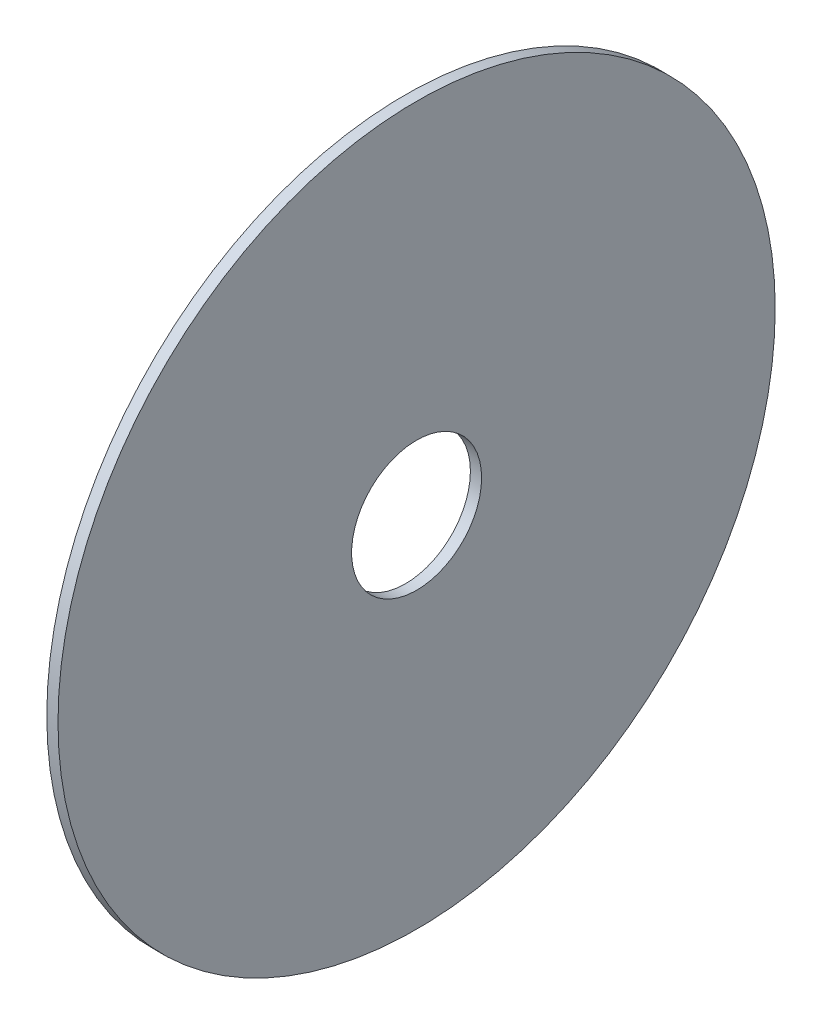
ISO-10303-21;
HEADER;
FILE_DESCRIPTION(('STEP AP214'),'2;1');
FILE_NAME('part.step','',(''),(''),'','','');
FILE_SCHEMA(('AUTOMOTIVE_DESIGN { 1 0 10303 214 1 1 1 1 }'));
ENDSEC;
DATA;
#1=APPLICATION_CONTEXT('core data for automotive mechanical design processes');
#2=APPLICATION_PROTOCOL_DEFINITION('international standard','automotive_design',2000,#1);
#3=PRODUCT_CONTEXT('',#1,'mechanical');
#4=PRODUCT('Part','Part','',(#3));
#5=PRODUCT_RELATED_PRODUCT_CATEGORY('part','',(#4));
#6=PRODUCT_DEFINITION_FORMATION('','',#4);
#7=PRODUCT_DEFINITION_CONTEXT('part definition',#1,'design');
#8=PRODUCT_DEFINITION('design','',#6,#7);
#9=PRODUCT_DEFINITION_SHAPE('','',#8);
#10=(LENGTH_UNIT() NAMED_UNIT(*) SI_UNIT(.MILLI.,.METRE.));
#11=(NAMED_UNIT(*) PLANE_ANGLE_UNIT() SI_UNIT($,.RADIAN.));
#12=(NAMED_UNIT(*) SI_UNIT($,.STERADIAN.) SOLID_ANGLE_UNIT());
#13=UNCERTAINTY_MEASURE_WITH_UNIT(LENGTH_MEASURE(1.E-05),#10,'distance_accuracy_value','');
#14=(GEOMETRIC_REPRESENTATION_CONTEXT(3) GLOBAL_UNCERTAINTY_ASSIGNED_CONTEXT((#13)) GLOBAL_UNIT_ASSIGNED_CONTEXT((#10,
#11,#12)) REPRESENTATION_CONTEXT('',''));
#15=CARTESIAN_POINT('',(0.,0.,0.));
#16=DIRECTION('',(0.,0.,1.));
#17=DIRECTION('',(1.,0.,0.));
#18=AXIS2_PLACEMENT_3D('',#15,#16,#17);
#19=CARTESIAN_POINT('',(0.79375,0.,0.));
#20=DIRECTION('',(1.,0.,0.));
#21=DIRECTION('',(0.,0.,-1.));
#22=AXIS2_PLACEMENT_3D('',#19,#20,#21);
#23=PLANE('',#22);
#24=CARTESIAN_POINT('',(0.79375,0.,0.));
#25=DIRECTION('',(1.,0.,0.));
#26=DIRECTION('',(0.,0.,-1.));
#27=AXIS2_PLACEMENT_3D('',#24,#25,#26);
#28=CIRCLE('',#27,50.8);
#29=CARTESIAN_POINT('',(0.79375,0.,-50.8));
#30=VERTEX_POINT('',#29);
#31=EDGE_CURVE('E10',#30,#30,#28,.T.);
#32=ORIENTED_EDGE('',*,*,#31,.T.);
#33=EDGE_LOOP('',(#32));
#34=FACE_BOUND('',#33,.T.);
#35=CARTESIAN_POINT('',(0.79375,0.,0.));
#36=DIRECTION('',(1.,0.,0.));
#37=DIRECTION('',(0.,0.,-1.));
#38=AXIS2_PLACEMENT_3D('',#35,#36,#37);
#39=CIRCLE('',#38,9.2075);
#40=CARTESIAN_POINT('',(0.79375,0.,-9.2075));
#41=VERTEX_POINT('',#40);
#42=EDGE_CURVE('E40',#41,#41,#39,.T.);
#43=ORIENTED_EDGE('',*,*,#42,.F.);
#44=EDGE_LOOP('',(#43));
#45=FACE_BOUND('',#44,.T.);
#46=ADVANCED_FACE('F29',(#34,#45),#23,.T.);
#47=CARTESIAN_POINT('',(-0.79375,0.,0.));
#48=DIRECTION('',(1.,0.,0.));
#49=DIRECTION('',(0.,0.,-1.));
#50=AXIS2_PLACEMENT_3D('',#47,#48,#49);
#51=PLANE('',#50);
#52=CARTESIAN_POINT('',(-0.79375,0.,0.));
#53=DIRECTION('',(1.,0.,0.));
#54=DIRECTION('',(0.,0.,-1.));
#55=AXIS2_PLACEMENT_3D('',#52,#53,#54);
#56=CIRCLE('',#55,50.8);
#57=CARTESIAN_POINT('',(-0.79375,0.,-50.8));
#58=VERTEX_POINT('',#57);
#59=EDGE_CURVE('E33',#58,#58,#56,.T.);
#60=ORIENTED_EDGE('',*,*,#59,.F.);
#61=EDGE_LOOP('',(#60));
#62=FACE_BOUND('',#61,.T.);
#63=CARTESIAN_POINT('',(-0.79375,0.,0.));
#64=DIRECTION('',(1.,0.,0.));
#65=DIRECTION('',(0.,0.,-1.));
#66=AXIS2_PLACEMENT_3D('',#63,#64,#65);
#67=CIRCLE('',#66,9.2075);
#68=CARTESIAN_POINT('',(-0.79375,0.,-9.2075));
#69=VERTEX_POINT('',#68);
#70=EDGE_CURVE('E42',#69,#69,#67,.T.);
#71=ORIENTED_EDGE('',*,*,#70,.T.);
#72=EDGE_LOOP('',(#71));
#73=FACE_BOUND('',#72,.T.);
#74=ADVANCED_FACE('F52',(#62,#73),#51,.F.);
#75=CARTESIAN_POINT('',(0.79375,0.,0.));
#76=DIRECTION('',(-1.,0.,0.));
#77=DIRECTION('',(0.,0.,1.));
#78=AXIS2_PLACEMENT_3D('',#75,#76,#77);
#79=CYLINDRICAL_SURFACE('',#78,50.8);
#80=ORIENTED_EDGE('',*,*,#31,.F.);
#81=EDGE_LOOP('',(#80));
#82=FACE_BOUND('',#81,.T.);
#83=ORIENTED_EDGE('',*,*,#59,.T.);
#84=EDGE_LOOP('',(#83));
#85=FACE_BOUND('',#84,.T.);
#86=ADVANCED_FACE('F31',(#82,#85),#79,.T.);
#87=CARTESIAN_POINT('',(0.79375,0.,0.));
#88=DIRECTION('',(-1.,0.,0.));
#89=DIRECTION('',(0.,0.,1.));
#90=AXIS2_PLACEMENT_3D('',#87,#88,#89);
#91=CYLINDRICAL_SURFACE('',#90,9.2075);
#92=ORIENTED_EDGE('',*,*,#42,.T.);
#93=EDGE_LOOP('',(#92));
#94=FACE_BOUND('',#93,.T.);
#95=ORIENTED_EDGE('',*,*,#70,.F.);
#96=EDGE_LOOP('',(#95));
#97=FACE_BOUND('',#96,.T.);
#98=ADVANCED_FACE('F48',(#94,#97),#91,.F.);
#99=CLOSED_SHELL('',(#46,#74,#86,#98));
#100=MANIFOLD_SOLID_BREP('B2',#99);
#101=ADVANCED_BREP_SHAPE_REPRESENTATION('',(#18,#100),#14);
#102=SHAPE_DEFINITION_REPRESENTATION(#9,#101);
ENDSEC;
END-ISO-10303-21;
